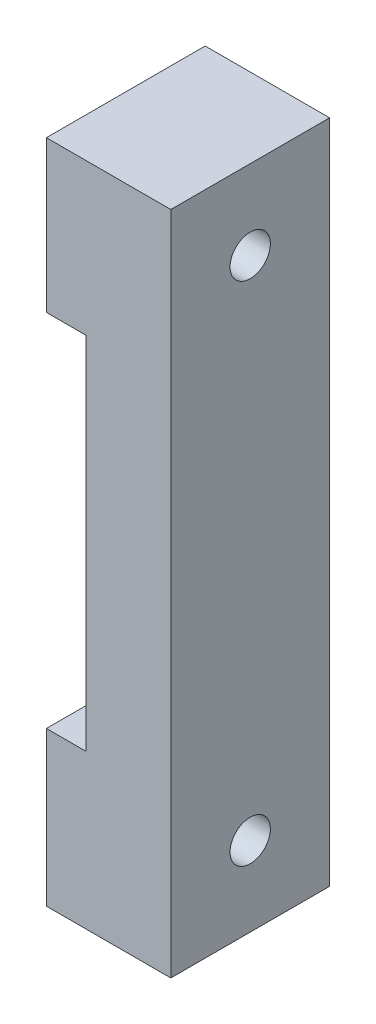
ISO-10303-21;
HEADER;
FILE_DESCRIPTION(('STEP AP214'),'2;1');
FILE_NAME('part.step','',(''),(''),'','','');
FILE_SCHEMA(('AUTOMOTIVE_DESIGN { 1 0 10303 214 1 1 1 1 }'));
ENDSEC;
DATA;
#1=APPLICATION_CONTEXT('core data for automotive mechanical design processes');
#2=APPLICATION_PROTOCOL_DEFINITION('international standard','automotive_design',2000,#1);
#3=PRODUCT_CONTEXT('',#1,'mechanical');
#4=PRODUCT('Part','Part','',(#3));
#5=PRODUCT_RELATED_PRODUCT_CATEGORY('part','',(#4));
#6=PRODUCT_DEFINITION_FORMATION('','',#4);
#7=PRODUCT_DEFINITION_CONTEXT('part definition',#1,'design');
#8=PRODUCT_DEFINITION('design','',#6,#7);
#9=PRODUCT_DEFINITION_SHAPE('','',#8);
#10=(LENGTH_UNIT() NAMED_UNIT(*) SI_UNIT(.MILLI.,.METRE.));
#11=(NAMED_UNIT(*) PLANE_ANGLE_UNIT() SI_UNIT($,.RADIAN.));
#12=(NAMED_UNIT(*) SI_UNIT($,.STERADIAN.) SOLID_ANGLE_UNIT());
#13=UNCERTAINTY_MEASURE_WITH_UNIT(LENGTH_MEASURE(1.E-05),#10,'distance_accuracy_value','');
#14=(GEOMETRIC_REPRESENTATION_CONTEXT(3) GLOBAL_UNCERTAINTY_ASSIGNED_CONTEXT((#13)) GLOBAL_UNIT_ASSIGNED_CONTEXT((#10,
#11,#12)) REPRESENTATION_CONTEXT('',''));
#15=CARTESIAN_POINT('',(0.,0.,0.));
#16=DIRECTION('',(0.,0.,1.));
#17=DIRECTION('',(1.,0.,0.));
#18=AXIS2_PLACEMENT_3D('',#15,#16,#17);
#19=CARTESIAN_POINT('',(0.,24.23,25.));
#20=DIRECTION('',(1.,0.,0.));
#21=DIRECTION('',(0.,0.,-1.));
#22=AXIS2_PLACEMENT_3D('',#19,#20,#21);
#23=PLANE('',#22);
#24=CARTESIAN_POINT('',(0.,12.5,12.5));
#25=DIRECTION('',(1.,0.,0.));
#26=DIRECTION('',(0.,0.,-1.));
#27=AXIS2_PLACEMENT_3D('',#24,#25,#26);
#28=CIRCLE('',#27,3.175);
#29=CARTESIAN_POINT('',(0.,12.5,9.325));
#30=VERTEX_POINT('',#29);
#31=EDGE_CURVE('E217',#30,#30,#28,.T.);
#32=ORIENTED_EDGE('',*,*,#31,.T.);
#33=EDGE_LOOP('',(#32));
#34=FACE_BOUND('',#33,.T.);
#35=DIRECTION('',(0.,-1.,0.));
#36=VECTOR('',#35,1.);
#37=CARTESIAN_POINT('',(0.,24.23,0.));
#38=LINE('',#37,#36);
#39=CARTESIAN_POINT('',(0.,24.23,0.));
#40=VERTEX_POINT('',#39);
#41=CARTESIAN_POINT('',(0.,0.,0.));
#42=VERTEX_POINT('',#41);
#43=EDGE_CURVE('E145',#40,#42,#38,.T.);
#44=ORIENTED_EDGE('',*,*,#43,.T.);
#45=DIRECTION('',(0.,0.,-1.));
#46=VECTOR('',#45,1.);
#47=CARTESIAN_POINT('',(0.,0.,25.));
#48=LINE('',#47,#46);
#49=CARTESIAN_POINT('',(0.,0.,25.));
#50=VERTEX_POINT('',#49);
#51=EDGE_CURVE('E11',#50,#42,#48,.T.);
#52=ORIENTED_EDGE('',*,*,#51,.F.);
#53=DIRECTION('',(0.,-1.,0.));
#54=VECTOR('',#53,1.);
#55=CARTESIAN_POINT('',(0.,24.23,25.));
#56=LINE('',#55,#54);
#57=CARTESIAN_POINT('',(0.,24.23,25.));
#58=VERTEX_POINT('',#57);
#59=EDGE_CURVE('E167',#58,#50,#56,.T.);
#60=ORIENTED_EDGE('',*,*,#59,.F.);
#61=DIRECTION('',(0.,0.,-1.));
#62=VECTOR('',#61,1.);
#63=CARTESIAN_POINT('',(0.,24.23,25.));
#64=LINE('',#63,#62);
#65=EDGE_CURVE('E141',#58,#40,#64,.T.);
#66=ORIENTED_EDGE('',*,*,#65,.T.);
#67=EDGE_LOOP('',(#44,#52,#60,#66));
#68=FACE_BOUND('',#67,.T.);
#69=ADVANCED_FACE('F43',(#34,#68),#23,.F.);
#70=CARTESIAN_POINT('',(0.,0.,25.));
#71=DIRECTION('',(0.,1.,0.));
#72=DIRECTION('',(0.,0.,1.));
#73=AXIS2_PLACEMENT_3D('',#70,#71,#72);
#74=PLANE('',#73);
#75=DIRECTION('',(1.,0.,0.));
#76=VECTOR('',#75,1.);
#77=CARTESIAN_POINT('',(0.,0.,0.));
#78=LINE('',#77,#76);
#79=CARTESIAN_POINT('',(19.584,0.,0.));
#80=VERTEX_POINT('',#79);
#81=EDGE_CURVE('E149',#42,#80,#78,.T.);
#82=ORIENTED_EDGE('',*,*,#81,.T.);
#83=DIRECTION('',(0.,0.,-1.));
#84=VECTOR('',#83,1.);
#85=CARTESIAN_POINT('',(19.584,0.,25.));
#86=LINE('',#85,#84);
#87=CARTESIAN_POINT('',(19.584,0.,25.));
#88=VERTEX_POINT('',#87);
#89=EDGE_CURVE('E53',#88,#80,#86,.T.);
#90=ORIENTED_EDGE('',*,*,#89,.F.);
#91=DIRECTION('',(1.,0.,0.));
#92=VECTOR('',#91,1.);
#93=CARTESIAN_POINT('',(0.,0.,25.));
#94=LINE('',#93,#92);
#95=EDGE_CURVE('E104',#50,#88,#94,.T.);
#96=ORIENTED_EDGE('',*,*,#95,.F.);
#97=ORIENTED_EDGE('',*,*,#51,.T.);
#98=EDGE_LOOP('',(#82,#90,#96,#97));
#99=FACE_BOUND('',#98,.T.);
#100=ADVANCED_FACE('F235',(#99),#74,.F.);
#101=CARTESIAN_POINT('',(19.584,0.,25.));
#102=DIRECTION('',(-1.,0.,0.));
#103=DIRECTION('',(0.,-1.,0.));
#104=AXIS2_PLACEMENT_3D('',#101,#102,#103);
#105=PLANE('',#104);
#106=CARTESIAN_POINT('',(19.584,92.28,12.5));
#107=DIRECTION('',(-1.,0.,0.));
#108=DIRECTION('',(0.,-1.,0.));
#109=AXIS2_PLACEMENT_3D('',#106,#107,#108);
#110=CIRCLE('',#109,3.175);
#111=CARTESIAN_POINT('',(19.584,89.105,12.5));
#112=VERTEX_POINT('',#111);
#113=EDGE_CURVE('E212',#112,#112,#110,.F.);
#114=ORIENTED_EDGE('',*,*,#113,.F.);
#115=EDGE_LOOP('',(#114));
#116=FACE_BOUND('',#115,.T.);
#117=CARTESIAN_POINT('',(19.584,12.5,12.5));
#118=DIRECTION('',(-1.,0.,0.));
#119=DIRECTION('',(0.,-1.,0.));
#120=AXIS2_PLACEMENT_3D('',#117,#118,#119);
#121=CIRCLE('',#120,3.175);
#122=CARTESIAN_POINT('',(19.584,9.325,12.5));
#123=VERTEX_POINT('',#122);
#124=EDGE_CURVE('E46',#123,#123,#121,.F.);
#125=ORIENTED_EDGE('',*,*,#124,.F.);
#126=EDGE_LOOP('',(#125));
#127=FACE_BOUND('',#126,.T.);
#128=DIRECTION('',(0.,1.,0.));
#129=VECTOR('',#128,1.);
#130=CARTESIAN_POINT('',(19.584,0.,0.));
#131=LINE('',#130,#129);
#132=CARTESIAN_POINT('',(19.584,104.78,0.));
#133=VERTEX_POINT('',#132);
#134=EDGE_CURVE('E152',#80,#133,#131,.T.);
#135=ORIENTED_EDGE('',*,*,#134,.T.);
#136=DIRECTION('',(0.,0.,-1.));
#137=VECTOR('',#136,1.);
#138=CARTESIAN_POINT('',(19.584,104.78,25.));
#139=LINE('',#138,#137);
#140=CARTESIAN_POINT('',(19.584,104.78,25.));
#141=VERTEX_POINT('',#140);
#142=EDGE_CURVE('E178',#141,#133,#139,.T.);
#143=ORIENTED_EDGE('',*,*,#142,.F.);
#144=DIRECTION('',(0.,1.,0.));
#145=VECTOR('',#144,1.);
#146=CARTESIAN_POINT('',(19.584,0.,25.));
#147=LINE('',#146,#145);
#148=EDGE_CURVE('E189',#88,#141,#147,.T.);
#149=ORIENTED_EDGE('',*,*,#148,.F.);
#150=ORIENTED_EDGE('',*,*,#89,.T.);
#151=EDGE_LOOP('',(#135,#143,#149,#150));
#152=FACE_BOUND('',#151,.T.);
#153=ADVANCED_FACE('F187',(#116,#127,#152),#105,.F.);
#154=CARTESIAN_POINT('',(19.584,104.78,25.));
#155=DIRECTION('',(0.,-1.,0.));
#156=DIRECTION('',(0.,0.,-1.));
#157=AXIS2_PLACEMENT_3D('',#154,#155,#156);
#158=PLANE('',#157);
#159=DIRECTION('',(-1.,0.,0.));
#160=VECTOR('',#159,1.);
#161=CARTESIAN_POINT('',(19.584,104.78,0.));
#162=LINE('',#161,#160);
#163=CARTESIAN_POINT('',(0.,104.78,0.));
#164=VERTEX_POINT('',#163);
#165=EDGE_CURVE('E155',#133,#164,#162,.T.);
#166=ORIENTED_EDGE('',*,*,#165,.T.);
#167=DIRECTION('',(0.,0.,-1.));
#168=VECTOR('',#167,1.);
#169=CARTESIAN_POINT('',(0.,104.78,25.));
#170=LINE('',#169,#168);
#171=CARTESIAN_POINT('',(0.,104.78,25.));
#172=VERTEX_POINT('',#171);
#173=EDGE_CURVE('E174',#172,#164,#170,.T.);
#174=ORIENTED_EDGE('',*,*,#173,.F.);
#175=DIRECTION('',(-1.,0.,0.));
#176=VECTOR('',#175,1.);
#177=CARTESIAN_POINT('',(19.584,104.78,25.));
#178=LINE('',#177,#176);
#179=EDGE_CURVE('E202',#141,#172,#178,.T.);
#180=ORIENTED_EDGE('',*,*,#179,.F.);
#181=ORIENTED_EDGE('',*,*,#142,.T.);
#182=EDGE_LOOP('',(#166,#174,#180,#181));
#183=FACE_BOUND('',#182,.T.);
#184=ADVANCED_FACE('F197',(#183),#158,.F.);
#185=CARTESIAN_POINT('',(0.,104.78,25.));
#186=DIRECTION('',(1.,0.,0.));
#187=DIRECTION('',(0.,1.,0.));
#188=AXIS2_PLACEMENT_3D('',#185,#186,#187);
#189=PLANE('',#188);
#190=CARTESIAN_POINT('',(0.,92.28,12.5));
#191=DIRECTION('',(1.,0.,0.));
#192=DIRECTION('',(0.,0.,-1.));
#193=AXIS2_PLACEMENT_3D('',#190,#191,#192);
#194=CIRCLE('',#193,3.175);
#195=CARTESIAN_POINT('',(0.,92.28,9.325));
#196=VERTEX_POINT('',#195);
#197=EDGE_CURVE('E216',#196,#196,#194,.T.);
#198=ORIENTED_EDGE('',*,*,#197,.T.);
#199=EDGE_LOOP('',(#198));
#200=FACE_BOUND('',#199,.T.);
#201=DIRECTION('',(0.,-1.,0.));
#202=VECTOR('',#201,1.);
#203=CARTESIAN_POINT('',(0.,104.78,0.));
#204=LINE('',#203,#202);
#205=CARTESIAN_POINT('',(0.,80.95,0.));
#206=VERTEX_POINT('',#205);
#207=EDGE_CURVE('E158',#164,#206,#204,.T.);
#208=ORIENTED_EDGE('',*,*,#207,.T.);
#209=DIRECTION('',(0.,0.,-1.));
#210=VECTOR('',#209,1.);
#211=CARTESIAN_POINT('',(0.,80.95,25.));
#212=LINE('',#211,#210);
#213=CARTESIAN_POINT('',(0.,80.95,25.));
#214=VERTEX_POINT('',#213);
#215=EDGE_CURVE('E134',#214,#206,#212,.T.);
#216=ORIENTED_EDGE('',*,*,#215,.F.);
#217=DIRECTION('',(0.,-1.,0.));
#218=VECTOR('',#217,1.);
#219=CARTESIAN_POINT('',(0.,104.78,25.));
#220=LINE('',#219,#218);
#221=EDGE_CURVE('E123',#172,#214,#220,.T.);
#222=ORIENTED_EDGE('',*,*,#221,.F.);
#223=ORIENTED_EDGE('',*,*,#173,.T.);
#224=EDGE_LOOP('',(#208,#216,#222,#223));
#225=FACE_BOUND('',#224,.T.);
#226=ADVANCED_FACE('F200',(#200,#225),#189,.F.);
#227=CARTESIAN_POINT('',(0.,80.95,25.));
#228=DIRECTION('',(0.,1.,0.));
#229=DIRECTION('',(0.,0.,1.));
#230=AXIS2_PLACEMENT_3D('',#227,#228,#229);
#231=PLANE('',#230);
#232=DIRECTION('',(1.,0.,0.));
#233=VECTOR('',#232,1.);
#234=CARTESIAN_POINT('',(0.,80.95,0.));
#235=LINE('',#234,#233);
#236=CARTESIAN_POINT('',(6.27,80.95,0.));
#237=VERTEX_POINT('',#236);
#238=EDGE_CURVE('E132',#206,#237,#235,.T.);
#239=ORIENTED_EDGE('',*,*,#238,.T.);
#240=DIRECTION('',(0.,0.,-1.));
#241=VECTOR('',#240,1.);
#242=CARTESIAN_POINT('',(6.27,80.95,25.));
#243=LINE('',#242,#241);
#244=CARTESIAN_POINT('',(6.27,80.95,25.));
#245=VERTEX_POINT('',#244);
#246=EDGE_CURVE('E129',#245,#237,#243,.T.);
#247=ORIENTED_EDGE('',*,*,#246,.F.);
#248=DIRECTION('',(1.,0.,0.));
#249=VECTOR('',#248,1.);
#250=CARTESIAN_POINT('',(0.,80.95,25.));
#251=LINE('',#250,#249);
#252=EDGE_CURVE('E117',#214,#245,#251,.T.);
#253=ORIENTED_EDGE('',*,*,#252,.F.);
#254=ORIENTED_EDGE('',*,*,#215,.T.);
#255=EDGE_LOOP('',(#239,#247,#253,#254));
#256=FACE_BOUND('',#255,.T.);
#257=ADVANCED_FACE('F130',(#256),#231,.F.);
#258=CARTESIAN_POINT('',(6.27,80.95,25.));
#259=DIRECTION('',(1.,0.,0.));
#260=DIRECTION('',(0.,1.,0.));
#261=AXIS2_PLACEMENT_3D('',#258,#259,#260);
#262=PLANE('',#261);
#263=DIRECTION('',(0.,-1.,0.));
#264=VECTOR('',#263,1.);
#265=CARTESIAN_POINT('',(6.27,80.95,0.));
#266=LINE('',#265,#264);
#267=CARTESIAN_POINT('',(6.27000000000001,24.23,0.));
#268=VERTEX_POINT('',#267);
#269=EDGE_CURVE('E90',#237,#268,#266,.T.);
#270=ORIENTED_EDGE('',*,*,#269,.T.);
#271=DIRECTION('',(0.,0.,-1.));
#272=VECTOR('',#271,1.);
#273=CARTESIAN_POINT('',(6.27000000000001,24.23,25.));
#274=LINE('',#273,#272);
#275=CARTESIAN_POINT('',(6.27000000000001,24.23,25.));
#276=VERTEX_POINT('',#275);
#277=EDGE_CURVE('E135',#276,#268,#274,.T.);
#278=ORIENTED_EDGE('',*,*,#277,.F.);
#279=DIRECTION('',(0.,-1.,0.));
#280=VECTOR('',#279,1.);
#281=CARTESIAN_POINT('',(6.27,80.95,25.));
#282=LINE('',#281,#280);
#283=EDGE_CURVE('E121',#245,#276,#282,.T.);
#284=ORIENTED_EDGE('',*,*,#283,.F.);
#285=ORIENTED_EDGE('',*,*,#246,.T.);
#286=EDGE_LOOP('',(#270,#278,#284,#285));
#287=FACE_BOUND('',#286,.T.);
#288=ADVANCED_FACE('F137',(#287),#262,.F.);
#289=CARTESIAN_POINT('',(6.27000000000001,24.23,25.));
#290=DIRECTION('',(0.,-1.,0.));
#291=DIRECTION('',(0.,0.,-1.));
#292=AXIS2_PLACEMENT_3D('',#289,#290,#291);
#293=PLANE('',#292);
#294=DIRECTION('',(-1.,0.,0.));
#295=VECTOR('',#294,1.);
#296=CARTESIAN_POINT('',(6.27000000000001,24.23,0.));
#297=LINE('',#296,#295);
#298=EDGE_CURVE('E96',#268,#40,#297,.T.);
#299=ORIENTED_EDGE('',*,*,#298,.T.);
#300=ORIENTED_EDGE('',*,*,#65,.F.);
#301=DIRECTION('',(-1.,0.,0.));
#302=VECTOR('',#301,1.);
#303=CARTESIAN_POINT('',(6.27000000000001,24.23,25.));
#304=LINE('',#303,#302);
#305=EDGE_CURVE('E61',#276,#58,#304,.T.);
#306=ORIENTED_EDGE('',*,*,#305,.F.);
#307=ORIENTED_EDGE('',*,*,#277,.T.);
#308=EDGE_LOOP('',(#299,#300,#306,#307));
#309=FACE_BOUND('',#308,.T.);
#310=ADVANCED_FACE('F256',(#309),#293,.F.);
#311=CARTESIAN_POINT('',(0.,0.,25.));
#312=DIRECTION('',(0.,0.,1.));
#313=DIRECTION('',(1.,0.,0.));
#314=AXIS2_PLACEMENT_3D('',#311,#312,#313);
#315=PLANE('',#314);
#316=ORIENTED_EDGE('',*,*,#59,.T.);
#317=ORIENTED_EDGE('',*,*,#95,.T.);
#318=ORIENTED_EDGE('',*,*,#148,.T.);
#319=ORIENTED_EDGE('',*,*,#179,.T.);
#320=ORIENTED_EDGE('',*,*,#221,.T.);
#321=ORIENTED_EDGE('',*,*,#252,.T.);
#322=ORIENTED_EDGE('',*,*,#283,.T.);
#323=ORIENTED_EDGE('',*,*,#305,.T.);
#324=EDGE_LOOP('',(#316,#317,#318,#319,#320,#321,#322,#323));
#325=FACE_BOUND('',#324,.T.);
#326=ADVANCED_FACE('F119',(#325),#315,.T.);
#327=CARTESIAN_POINT('',(0.,0.,0.));
#328=DIRECTION('',(0.,0.,1.));
#329=DIRECTION('',(1.,0.,0.));
#330=AXIS2_PLACEMENT_3D('',#327,#328,#329);
#331=PLANE('',#330);
#332=ORIENTED_EDGE('',*,*,#43,.F.);
#333=ORIENTED_EDGE('',*,*,#298,.F.);
#334=ORIENTED_EDGE('',*,*,#269,.F.);
#335=ORIENTED_EDGE('',*,*,#238,.F.);
#336=ORIENTED_EDGE('',*,*,#207,.F.);
#337=ORIENTED_EDGE('',*,*,#165,.F.);
#338=ORIENTED_EDGE('',*,*,#134,.F.);
#339=ORIENTED_EDGE('',*,*,#81,.F.);
#340=EDGE_LOOP('',(#332,#333,#334,#335,#336,#337,#338,#339));
#341=FACE_BOUND('',#340,.T.);
#342=ADVANCED_FACE('F193',(#341),#331,.F.);
#343=CARTESIAN_POINT('',(40.,92.28,12.5));
#344=DIRECTION('',(-1.,0.,0.));
#345=DIRECTION('',(0.,0.,1.));
#346=AXIS2_PLACEMENT_3D('',#343,#344,#345);
#347=CYLINDRICAL_SURFACE('',#346,3.175);
#348=ORIENTED_EDGE('',*,*,#197,.F.);
#349=EDGE_LOOP('',(#348));
#350=FACE_BOUND('',#349,.T.);
#351=ORIENTED_EDGE('',*,*,#113,.T.);
#352=EDGE_LOOP('',(#351));
#353=FACE_BOUND('',#352,.T.);
#354=ADVANCED_FACE('F226',(#350,#353),#347,.F.);
#355=CARTESIAN_POINT('',(40.,12.5,12.5));
#356=DIRECTION('',(-1.,0.,0.));
#357=DIRECTION('',(0.,0.,1.));
#358=AXIS2_PLACEMENT_3D('',#355,#356,#357);
#359=CYLINDRICAL_SURFACE('',#358,3.175);
#360=ORIENTED_EDGE('',*,*,#31,.F.);
#361=EDGE_LOOP('',(#360));
#362=FACE_BOUND('',#361,.T.);
#363=ORIENTED_EDGE('',*,*,#124,.T.);
#364=EDGE_LOOP('',(#363));
#365=FACE_BOUND('',#364,.T.);
#366=ADVANCED_FACE('F229',(#362,#365),#359,.F.);
#367=CLOSED_SHELL('',(#69,#100,#153,#184,#226,#257,#288,#310,#326,#342,#354,#366));
#368=MANIFOLD_SOLID_BREP('B2',#367);
#369=ADVANCED_BREP_SHAPE_REPRESENTATION('',(#18,#368),#14);
#370=SHAPE_DEFINITION_REPRESENTATION(#9,#369);
ENDSEC;
END-ISO-10303-21;
